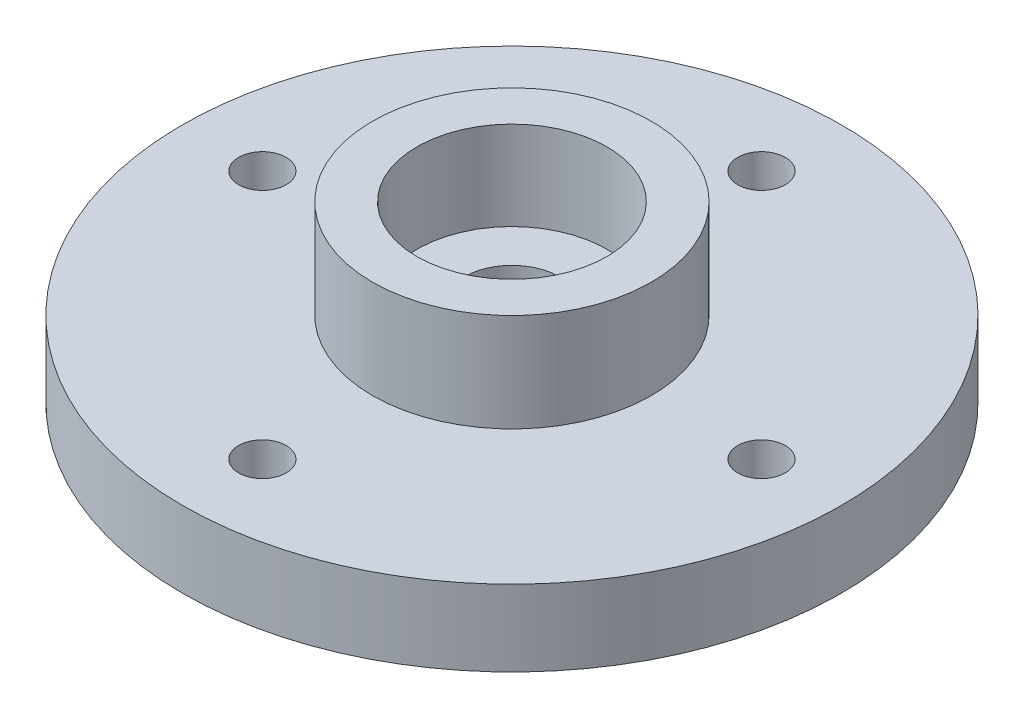
ISO-10303-21;
HEADER;
FILE_DESCRIPTION(('STEP AP214'),'2;1');
FILE_NAME('part.step','',(''),(''),'','','');
FILE_SCHEMA(('AUTOMOTIVE_DESIGN { 1 0 10303 214 1 1 1 1 }'));
ENDSEC;
DATA;
#1=APPLICATION_CONTEXT('core data for automotive mechanical design processes');
#2=APPLICATION_PROTOCOL_DEFINITION('international standard','automotive_design',2000,#1);
#3=PRODUCT_CONTEXT('',#1,'mechanical');
#4=PRODUCT('Part','Part','',(#3));
#5=PRODUCT_RELATED_PRODUCT_CATEGORY('part','',(#4));
#6=PRODUCT_DEFINITION_FORMATION('','',#4);
#7=PRODUCT_DEFINITION_CONTEXT('part definition',#1,'design');
#8=PRODUCT_DEFINITION('design','',#6,#7);
#9=PRODUCT_DEFINITION_SHAPE('','',#8);
#10=(LENGTH_UNIT() NAMED_UNIT(*) SI_UNIT(.MILLI.,.METRE.));
#11=(NAMED_UNIT(*) PLANE_ANGLE_UNIT() SI_UNIT($,.RADIAN.));
#12=(NAMED_UNIT(*) SI_UNIT($,.STERADIAN.) SOLID_ANGLE_UNIT());
#13=UNCERTAINTY_MEASURE_WITH_UNIT(LENGTH_MEASURE(1.E-05),#10,'distance_accuracy_value','');
#14=(GEOMETRIC_REPRESENTATION_CONTEXT(3) GLOBAL_UNCERTAINTY_ASSIGNED_CONTEXT((#13)) GLOBAL_UNIT_ASSIGNED_CONTEXT((#10,
#11,#12)) REPRESENTATION_CONTEXT('',''));
#15=CARTESIAN_POINT('',(0.,0.,0.));
#16=DIRECTION('',(0.,0.,1.));
#17=DIRECTION('',(1.,0.,0.));
#18=AXIS2_PLACEMENT_3D('',#15,#16,#17);
#19=CARTESIAN_POINT('',(0.,2.4,0.));
#20=DIRECTION('',(0.,-1.,0.));
#21=DIRECTION('',(0.,0.,-1.));
#22=AXIS2_PLACEMENT_3D('',#19,#20,#21);
#23=CYLINDRICAL_SURFACE('',#22,10.4);
#24=CARTESIAN_POINT('',(0.,2.4,0.));
#25=DIRECTION('',(0.,1.,0.));
#26=DIRECTION('',(0.,0.,1.));
#27=AXIS2_PLACEMENT_3D('',#24,#25,#26);
#28=CIRCLE('',#27,10.4);
#29=CARTESIAN_POINT('',(0.,2.4,10.4));
#30=VERTEX_POINT('',#29);
#31=EDGE_CURVE('E10',#30,#30,#28,.T.);
#32=ORIENTED_EDGE('',*,*,#31,.F.);
#33=EDGE_LOOP('',(#32));
#34=FACE_BOUND('',#33,.T.);
#35=CARTESIAN_POINT('',(0.,0.,0.));
#36=DIRECTION('',(0.,1.,0.));
#37=DIRECTION('',(0.,0.,1.));
#38=AXIS2_PLACEMENT_3D('',#35,#36,#37);
#39=CIRCLE('',#38,10.4);
#40=CARTESIAN_POINT('',(0.,0.,10.4));
#41=VERTEX_POINT('',#40);
#42=EDGE_CURVE('E46',#41,#41,#39,.T.);
#43=ORIENTED_EDGE('',*,*,#42,.T.);
#44=EDGE_LOOP('',(#43));
#45=FACE_BOUND('',#44,.T.);
#46=ADVANCED_FACE('F43',(#34,#45),#23,.T.);
#47=CARTESIAN_POINT('',(0.,2.4,0.));
#48=DIRECTION('',(0.,1.,0.));
#49=DIRECTION('',(0.,0.,1.));
#50=AXIS2_PLACEMENT_3D('',#47,#48,#49);
#51=PLANE('',#50);
#52=CARTESIAN_POINT('',(0.,2.4,-7.875));
#53=DIRECTION('',(0.,1.,0.));
#54=DIRECTION('',(0.,0.,1.));
#55=AXIS2_PLACEMENT_3D('',#52,#53,#54);
#56=CIRCLE('',#55,0.75);
#57=CARTESIAN_POINT('',(0.,2.4,-7.125));
#58=VERTEX_POINT('',#57);
#59=EDGE_CURVE('E98',#58,#58,#56,.T.);
#60=ORIENTED_EDGE('',*,*,#59,.F.);
#61=EDGE_LOOP('',(#60));
#62=FACE_BOUND('',#61,.T.);
#63=CARTESIAN_POINT('',(7.875,2.4,0.));
#64=DIRECTION('',(0.,1.,0.));
#65=DIRECTION('',(0.,0.,1.));
#66=AXIS2_PLACEMENT_3D('',#63,#64,#65);
#67=CIRCLE('',#66,0.750000000000001);
#68=CARTESIAN_POINT('',(7.875,2.4,0.750000000000029));
#69=VERTEX_POINT('',#68);
#70=EDGE_CURVE('E94',#69,#69,#67,.T.);
#71=ORIENTED_EDGE('',*,*,#70,.F.);
#72=EDGE_LOOP('',(#71));
#73=FACE_BOUND('',#72,.T.);
#74=CARTESIAN_POINT('',(0.,2.4,7.875));
#75=DIRECTION('',(0.,1.,0.));
#76=DIRECTION('',(0.,0.,1.));
#77=AXIS2_PLACEMENT_3D('',#74,#75,#76);
#78=CIRCLE('',#77,0.75);
#79=CARTESIAN_POINT('',(0.,2.4,8.625));
#80=VERTEX_POINT('',#79);
#81=EDGE_CURVE('E86',#80,#80,#78,.T.);
#82=ORIENTED_EDGE('',*,*,#81,.F.);
#83=EDGE_LOOP('',(#82));
#84=FACE_BOUND('',#83,.T.);
#85=CARTESIAN_POINT('',(-7.875,2.4,0.));
#86=DIRECTION('',(0.,1.,0.));
#87=DIRECTION('',(0.,0.,1.));
#88=AXIS2_PLACEMENT_3D('',#85,#86,#87);
#89=CIRCLE('',#88,0.75);
#90=CARTESIAN_POINT('',(-7.875,2.4,0.749999999999917));
#91=VERTEX_POINT('',#90);
#92=EDGE_CURVE('E77',#91,#91,#89,.T.);
#93=ORIENTED_EDGE('',*,*,#92,.F.);
#94=EDGE_LOOP('',(#93));
#95=FACE_BOUND('',#94,.T.);
#96=CARTESIAN_POINT('',(0.,2.4,0.));
#97=DIRECTION('',(0.,1.,0.));
#98=DIRECTION('',(0.,0.,1.));
#99=AXIS2_PLACEMENT_3D('',#96,#97,#98);
#100=CIRCLE('',#99,4.4);
#101=CARTESIAN_POINT('',(0.,2.4,4.4));
#102=VERTEX_POINT('',#101);
#103=EDGE_CURVE('E55',#102,#102,#100,.F.);
#104=ORIENTED_EDGE('',*,*,#103,.T.);
#105=EDGE_LOOP('',(#104));
#106=FACE_BOUND('',#105,.T.);
#107=ORIENTED_EDGE('',*,*,#31,.T.);
#108=EDGE_LOOP('',(#107));
#109=FACE_BOUND('',#108,.T.);
#110=ADVANCED_FACE('F150',(#62,#73,#84,#95,#106,#109),#51,.T.);
#111=CARTESIAN_POINT('',(0.,0.,0.));
#112=DIRECTION('',(0.,1.,0.));
#113=DIRECTION('',(0.,0.,1.));
#114=AXIS2_PLACEMENT_3D('',#111,#112,#113);
#115=PLANE('',#114);
#116=CARTESIAN_POINT('',(0.,0.,0.));
#117=DIRECTION('',(0.,1.,0.));
#118=DIRECTION('',(0.,0.,1.));
#119=AXIS2_PLACEMENT_3D('',#116,#117,#118);
#120=CIRCLE('',#119,1.5);
#121=CARTESIAN_POINT('',(0.,0.,1.5));
#122=VERTEX_POINT('',#121);
#123=EDGE_CURVE('E78',#122,#122,#120,.T.);
#124=ORIENTED_EDGE('',*,*,#123,.T.);
#125=EDGE_LOOP('',(#124));
#126=FACE_BOUND('',#125,.T.);
#127=CARTESIAN_POINT('',(0.,0.,-7.875));
#128=DIRECTION('',(0.,1.,0.));
#129=DIRECTION('',(0.,0.,1.));
#130=AXIS2_PLACEMENT_3D('',#127,#128,#129);
#131=CIRCLE('',#130,0.75);
#132=CARTESIAN_POINT('',(0.,0.,-7.125));
#133=VERTEX_POINT('',#132);
#134=EDGE_CURVE('E69',#133,#133,#131,.T.);
#135=ORIENTED_EDGE('',*,*,#134,.T.);
#136=EDGE_LOOP('',(#135));
#137=FACE_BOUND('',#136,.T.);
#138=CARTESIAN_POINT('',(7.875,0.,0.));
#139=DIRECTION('',(0.,1.,0.));
#140=DIRECTION('',(0.,0.,1.));
#141=AXIS2_PLACEMENT_3D('',#138,#139,#140);
#142=CIRCLE('',#141,0.750000000000001);
#143=CARTESIAN_POINT('',(7.875,0.,0.750000000000029));
#144=VERTEX_POINT('',#143);
#145=EDGE_CURVE('E90',#144,#144,#142,.T.);
#146=ORIENTED_EDGE('',*,*,#145,.T.);
#147=EDGE_LOOP('',(#146));
#148=FACE_BOUND('',#147,.T.);
#149=CARTESIAN_POINT('',(0.,0.,7.875));
#150=DIRECTION('',(0.,1.,0.));
#151=DIRECTION('',(0.,0.,1.));
#152=AXIS2_PLACEMENT_3D('',#149,#150,#151);
#153=CIRCLE('',#152,0.75);
#154=CARTESIAN_POINT('',(0.,0.,8.625));
#155=VERTEX_POINT('',#154);
#156=EDGE_CURVE('E82',#155,#155,#153,.T.);
#157=ORIENTED_EDGE('',*,*,#156,.T.);
#158=EDGE_LOOP('',(#157));
#159=FACE_BOUND('',#158,.T.);
#160=CARTESIAN_POINT('',(-7.875,0.,0.));
#161=DIRECTION('',(0.,1.,0.));
#162=DIRECTION('',(0.,0.,1.));
#163=AXIS2_PLACEMENT_3D('',#160,#161,#162);
#164=CIRCLE('',#163,0.75);
#165=CARTESIAN_POINT('',(-7.875,0.,0.749999999999917));
#166=VERTEX_POINT('',#165);
#167=EDGE_CURVE('E73',#166,#166,#164,.T.);
#168=ORIENTED_EDGE('',*,*,#167,.T.);
#169=EDGE_LOOP('',(#168));
#170=FACE_BOUND('',#169,.T.);
#171=ORIENTED_EDGE('',*,*,#42,.F.);
#172=EDGE_LOOP('',(#171));
#173=FACE_BOUND('',#172,.T.);
#174=ADVANCED_FACE('F113',(#126,#137,#148,#159,#170,#173),#115,.F.);
#175=CARTESIAN_POINT('',(0.,5.5,0.));
#176=DIRECTION('',(0.,-1.,0.));
#177=DIRECTION('',(0.,0.,-1.));
#178=AXIS2_PLACEMENT_3D('',#175,#176,#177);
#179=CYLINDRICAL_SURFACE('',#178,4.4);
#180=ORIENTED_EDGE('',*,*,#103,.F.);
#181=EDGE_LOOP('',(#180));
#182=FACE_BOUND('',#181,.T.);
#183=CARTESIAN_POINT('',(0.,5.5,0.));
#184=DIRECTION('',(0.,1.,0.));
#185=DIRECTION('',(0.,0.,1.));
#186=AXIS2_PLACEMENT_3D('',#183,#184,#185);
#187=CIRCLE('',#186,4.4);
#188=CARTESIAN_POINT('',(0.,5.5,4.4));
#189=VERTEX_POINT('',#188);
#190=EDGE_CURVE('E60',#189,#189,#187,.T.);
#191=ORIENTED_EDGE('',*,*,#190,.F.);
#192=EDGE_LOOP('',(#191));
#193=FACE_BOUND('',#192,.T.);
#194=ADVANCED_FACE('F139',(#182,#193),#179,.T.);
#195=CARTESIAN_POINT('',(0.,5.5,0.));
#196=DIRECTION('',(0.,1.,0.));
#197=DIRECTION('',(0.,0.,1.));
#198=AXIS2_PLACEMENT_3D('',#195,#196,#197);
#199=PLANE('',#198);
#200=CARTESIAN_POINT('',(0.,5.5,0.));
#201=DIRECTION('',(0.,1.,0.));
#202=DIRECTION('',(0.,0.,1.));
#203=AXIS2_PLACEMENT_3D('',#200,#201,#202);
#204=CIRCLE('',#203,3.);
#205=CARTESIAN_POINT('',(0.,5.5,3.));
#206=VERTEX_POINT('',#205);
#207=EDGE_CURVE('E65',#206,#206,#204,.T.);
#208=ORIENTED_EDGE('',*,*,#207,.F.);
#209=EDGE_LOOP('',(#208));
#210=FACE_BOUND('',#209,.T.);
#211=ORIENTED_EDGE('',*,*,#190,.T.);
#212=EDGE_LOOP('',(#211));
#213=FACE_BOUND('',#212,.T.);
#214=ADVANCED_FACE('F133',(#210,#213),#199,.T.);
#215=CARTESIAN_POINT('',(0.,2.7,0.));
#216=DIRECTION('',(0.,1.,0.));
#217=DIRECTION('',(0.,0.,1.));
#218=AXIS2_PLACEMENT_3D('',#215,#216,#217);
#219=CYLINDRICAL_SURFACE('',#218,3.);
#220=CARTESIAN_POINT('',(0.,2.7,0.));
#221=DIRECTION('',(0.,1.,0.));
#222=DIRECTION('',(0.,0.,1.));
#223=AXIS2_PLACEMENT_3D('',#220,#221,#222);
#224=CIRCLE('',#223,3.);
#225=CARTESIAN_POINT('',(0.,2.7,3.));
#226=VERTEX_POINT('',#225);
#227=EDGE_CURVE('E64',#226,#226,#224,.T.);
#228=ORIENTED_EDGE('',*,*,#227,.F.);
#229=EDGE_LOOP('',(#228));
#230=FACE_BOUND('',#229,.T.);
#231=ORIENTED_EDGE('',*,*,#207,.T.);
#232=EDGE_LOOP('',(#231));
#233=FACE_BOUND('',#232,.T.);
#234=ADVANCED_FACE('F127',(#230,#233),#219,.F.);
#235=CARTESIAN_POINT('',(0.,2.7,0.));
#236=DIRECTION('',(0.,1.,0.));
#237=DIRECTION('',(0.,0.,1.));
#238=AXIS2_PLACEMENT_3D('',#235,#236,#237);
#239=PLANE('',#238);
#240=CARTESIAN_POINT('',(0.,2.7,0.));
#241=DIRECTION('',(0.,1.,0.));
#242=DIRECTION('',(0.,0.,1.));
#243=AXIS2_PLACEMENT_3D('',#240,#241,#242);
#244=CIRCLE('',#243,1.5);
#245=CARTESIAN_POINT('',(0.,2.7,1.5));
#246=VERTEX_POINT('',#245);
#247=EDGE_CURVE('E105',#246,#246,#244,.T.);
#248=ORIENTED_EDGE('',*,*,#247,.F.);
#249=EDGE_LOOP('',(#248));
#250=FACE_BOUND('',#249,.T.);
#251=ORIENTED_EDGE('',*,*,#227,.T.);
#252=EDGE_LOOP('',(#251));
#253=FACE_BOUND('',#252,.T.);
#254=ADVANCED_FACE('F123',(#250,#253),#239,.T.);
#255=CARTESIAN_POINT('',(-7.875,0.,0.));
#256=DIRECTION('',(0.,1.,0.));
#257=DIRECTION('',(0.,0.,1.));
#258=AXIS2_PLACEMENT_3D('',#255,#256,#257);
#259=CYLINDRICAL_SURFACE('',#258,0.75);
#260=ORIENTED_EDGE('',*,*,#167,.F.);
#261=EDGE_LOOP('',(#260));
#262=FACE_BOUND('',#261,.T.);
#263=ORIENTED_EDGE('',*,*,#92,.T.);
#264=EDGE_LOOP('',(#263));
#265=FACE_BOUND('',#264,.T.);
#266=ADVANCED_FACE('F126',(#262,#265),#259,.F.);
#267=CARTESIAN_POINT('',(0.,0.,7.875));
#268=DIRECTION('',(0.,1.,0.));
#269=DIRECTION('',(0.,0.,1.));
#270=AXIS2_PLACEMENT_3D('',#267,#268,#269);
#271=CYLINDRICAL_SURFACE('',#270,0.75);
#272=ORIENTED_EDGE('',*,*,#156,.F.);
#273=EDGE_LOOP('',(#272));
#274=FACE_BOUND('',#273,.T.);
#275=ORIENTED_EDGE('',*,*,#81,.T.);
#276=EDGE_LOOP('',(#275));
#277=FACE_BOUND('',#276,.T.);
#278=ADVANCED_FACE('F173',(#274,#277),#271,.F.);
#279=CARTESIAN_POINT('',(7.875,0.,0.));
#280=DIRECTION('',(0.,1.,0.));
#281=DIRECTION('',(0.,0.,1.));
#282=AXIS2_PLACEMENT_3D('',#279,#280,#281);
#283=CYLINDRICAL_SURFACE('',#282,0.750000000000001);
#284=ORIENTED_EDGE('',*,*,#145,.F.);
#285=EDGE_LOOP('',(#284));
#286=FACE_BOUND('',#285,.T.);
#287=ORIENTED_EDGE('',*,*,#70,.T.);
#288=EDGE_LOOP('',(#287));
#289=FACE_BOUND('',#288,.T.);
#290=ADVANCED_FACE('F179',(#286,#289),#283,.F.);
#291=CARTESIAN_POINT('',(0.,0.,-7.875));
#292=DIRECTION('',(0.,1.,0.));
#293=DIRECTION('',(0.,0.,1.));
#294=AXIS2_PLACEMENT_3D('',#291,#292,#293);
#295=CYLINDRICAL_SURFACE('',#294,0.75);
#296=ORIENTED_EDGE('',*,*,#134,.F.);
#297=EDGE_LOOP('',(#296));
#298=FACE_BOUND('',#297,.T.);
#299=ORIENTED_EDGE('',*,*,#59,.T.);
#300=EDGE_LOOP('',(#299));
#301=FACE_BOUND('',#300,.T.);
#302=ADVANCED_FACE('F119',(#298,#301),#295,.F.);
#303=CARTESIAN_POINT('',(0.,0.,0.));
#304=DIRECTION('',(0.,1.,0.));
#305=DIRECTION('',(0.,0.,1.));
#306=AXIS2_PLACEMENT_3D('',#303,#304,#305);
#307=CYLINDRICAL_SURFACE('',#306,1.5);
#308=ORIENTED_EDGE('',*,*,#123,.F.);
#309=EDGE_LOOP('',(#308));
#310=FACE_BOUND('',#309,.T.);
#311=ORIENTED_EDGE('',*,*,#247,.T.);
#312=EDGE_LOOP('',(#311));
#313=FACE_BOUND('',#312,.T.);
#314=ADVANCED_FACE('F116',(#310,#313),#307,.F.);
#315=CLOSED_SHELL('',(#46,#110,#174,#194,#214,#234,#254,#266,#278,#290,#302,#314));
#316=MANIFOLD_SOLID_BREP('B2',#315);
#317=ADVANCED_BREP_SHAPE_REPRESENTATION('',(#18,#316),#14);
#318=SHAPE_DEFINITION_REPRESENTATION(#9,#317);
ENDSEC;
END-ISO-10303-21;
